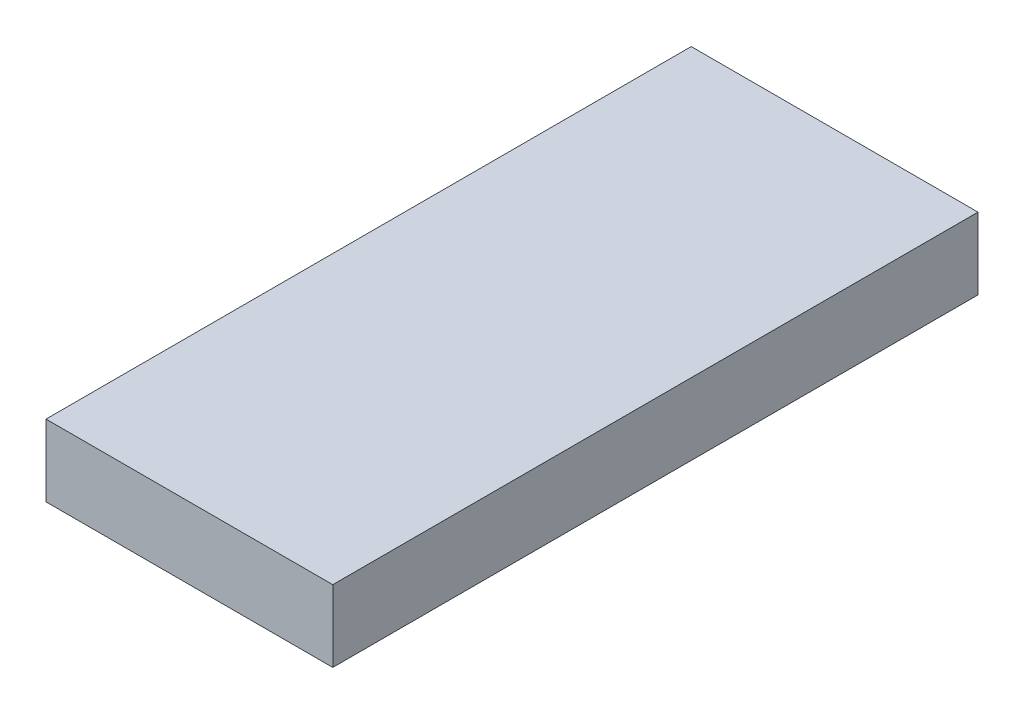
ISO-10303-21;
HEADER;
FILE_DESCRIPTION(('STEP AP214'),'2;1');
FILE_NAME('part.step','',(''),(''),'','','');
FILE_SCHEMA(('AUTOMOTIVE_DESIGN { 1 0 10303 214 1 1 1 1 }'));
ENDSEC;
DATA;
#1=APPLICATION_CONTEXT('core data for automotive mechanical design processes');
#2=APPLICATION_PROTOCOL_DEFINITION('international standard','automotive_design',2000,#1);
#3=PRODUCT_CONTEXT('',#1,'mechanical');
#4=PRODUCT('Part','Part','',(#3));
#5=PRODUCT_RELATED_PRODUCT_CATEGORY('part','',(#4));
#6=PRODUCT_DEFINITION_FORMATION('','',#4);
#7=PRODUCT_DEFINITION_CONTEXT('part definition',#1,'design');
#8=PRODUCT_DEFINITION('design','',#6,#7);
#9=PRODUCT_DEFINITION_SHAPE('','',#8);
#10=(LENGTH_UNIT() NAMED_UNIT(*) SI_UNIT(.MILLI.,.METRE.));
#11=(NAMED_UNIT(*) PLANE_ANGLE_UNIT() SI_UNIT($,.RADIAN.));
#12=(NAMED_UNIT(*) SI_UNIT($,.STERADIAN.) SOLID_ANGLE_UNIT());
#13=UNCERTAINTY_MEASURE_WITH_UNIT(LENGTH_MEASURE(1.E-05),#10,'distance_accuracy_value','');
#14=(GEOMETRIC_REPRESENTATION_CONTEXT(3) GLOBAL_UNCERTAINTY_ASSIGNED_CONTEXT((#13)) GLOBAL_UNIT_ASSIGNED_CONTEXT((#10,
#11,#12)) REPRESENTATION_CONTEXT('',''));
#15=CARTESIAN_POINT('',(0.,0.,0.));
#16=DIRECTION('',(0.,0.,1.));
#17=DIRECTION('',(1.,0.,0.));
#18=AXIS2_PLACEMENT_3D('',#15,#16,#17);
#19=CARTESIAN_POINT('',(-1.99999854,0.499999,0.));
#20=DIRECTION('',(1.,0.,0.));
#21=DIRECTION('',(0.,-1.,0.));
#22=AXIS2_PLACEMENT_3D('',#19,#20,#21);
#23=PLANE('',#22);
#24=DIRECTION('',(0.,-1.,0.));
#25=VECTOR('',#24,1.);
#26=CARTESIAN_POINT('',(-1.99999854,0.499999,0.));
#27=LINE('',#26,#25);
#28=CARTESIAN_POINT('',(-1.99999854,0.499999,0.));
#29=VERTEX_POINT('',#28);
#30=CARTESIAN_POINT('',(-1.99999854,-0.499999,0.));
#31=VERTEX_POINT('',#30);
#32=EDGE_CURVE('E11',#29,#31,#27,.T.);
#33=ORIENTED_EDGE('',*,*,#32,.T.);
#34=DIRECTION('',(0.,0.,1.));
#35=VECTOR('',#34,1.);
#36=CARTESIAN_POINT('',(-1.99999854,-0.499999,0.));
#37=LINE('',#36,#35);
#38=CARTESIAN_POINT('',(-1.99999854,-0.499999,8.99999978));
#39=VERTEX_POINT('',#38);
#40=EDGE_CURVE('E24',#31,#39,#37,.T.);
#41=ORIENTED_EDGE('',*,*,#40,.T.);
#42=DIRECTION('',(0.,-1.,0.));
#43=VECTOR('',#42,1.);
#44=CARTESIAN_POINT('',(-1.99999854,0.499999,8.99999978));
#45=LINE('',#44,#43);
#46=CARTESIAN_POINT('',(-1.99999854,0.499999,8.99999978));
#47=VERTEX_POINT('',#46);
#48=EDGE_CURVE('E87',#47,#39,#45,.T.);
#49=ORIENTED_EDGE('',*,*,#48,.F.);
#50=DIRECTION('',(0.,0.,1.));
#51=VECTOR('',#50,1.);
#52=CARTESIAN_POINT('',(-1.99999854,0.499999,0.));
#53=LINE('',#52,#51);
#54=EDGE_CURVE('E36',#29,#47,#53,.T.);
#55=ORIENTED_EDGE('',*,*,#54,.F.);
#56=EDGE_LOOP('',(#33,#41,#49,#55));
#57=FACE_BOUND('',#56,.T.);
#58=ADVANCED_FACE('F17',(#57),#23,.F.);
#59=CARTESIAN_POINT('',(-1.99999854,-0.499999,0.));
#60=DIRECTION('',(0.,1.,0.));
#61=DIRECTION('',(1.,0.,0.));
#62=AXIS2_PLACEMENT_3D('',#59,#60,#61);
#63=PLANE('',#62);
#64=DIRECTION('',(1.,0.,0.));
#65=VECTOR('',#64,1.);
#66=CARTESIAN_POINT('',(-1.99999854,-0.499999,0.));
#67=LINE('',#66,#65);
#68=CARTESIAN_POINT('',(2.00000108,-0.499999,0.));
#69=VERTEX_POINT('',#68);
#70=EDGE_CURVE('E84',#31,#69,#67,.T.);
#71=ORIENTED_EDGE('',*,*,#70,.T.);
#72=DIRECTION('',(0.,0.,1.));
#73=VECTOR('',#72,1.);
#74=CARTESIAN_POINT('',(2.00000108,-0.499999,0.));
#75=LINE('',#74,#73);
#76=CARTESIAN_POINT('',(2.00000108,-0.499999,8.99999978));
#77=VERTEX_POINT('',#76);
#78=EDGE_CURVE('E82',#69,#77,#75,.T.);
#79=ORIENTED_EDGE('',*,*,#78,.T.);
#80=DIRECTION('',(1.,0.,0.));
#81=VECTOR('',#80,1.);
#82=CARTESIAN_POINT('',(-1.99999854,-0.499999,8.99999978));
#83=LINE('',#82,#81);
#84=EDGE_CURVE('E62',#39,#77,#83,.T.);
#85=ORIENTED_EDGE('',*,*,#84,.F.);
#86=ORIENTED_EDGE('',*,*,#40,.F.);
#87=EDGE_LOOP('',(#71,#79,#85,#86));
#88=FACE_BOUND('',#87,.T.);
#89=ADVANCED_FACE('F89',(#88),#63,.F.);
#90=CARTESIAN_POINT('',(2.00000108,-0.499999,0.));
#91=DIRECTION('',(-1.,0.,0.));
#92=DIRECTION('',(0.,1.,0.));
#93=AXIS2_PLACEMENT_3D('',#90,#91,#92);
#94=PLANE('',#93);
#95=DIRECTION('',(0.,1.,0.));
#96=VECTOR('',#95,1.);
#97=CARTESIAN_POINT('',(2.00000108,-0.499999,0.));
#98=LINE('',#97,#96);
#99=CARTESIAN_POINT('',(2.00000108,0.499999,0.));
#100=VERTEX_POINT('',#99);
#101=EDGE_CURVE('E71',#69,#100,#98,.T.);
#102=ORIENTED_EDGE('',*,*,#101,.T.);
#103=DIRECTION('',(0.,0.,1.));
#104=VECTOR('',#103,1.);
#105=CARTESIAN_POINT('',(2.00000108,0.499999,0.));
#106=LINE('',#105,#104);
#107=CARTESIAN_POINT('',(2.00000108,0.499999,8.99999978));
#108=VERTEX_POINT('',#107);
#109=EDGE_CURVE('E65',#100,#108,#106,.T.);
#110=ORIENTED_EDGE('',*,*,#109,.T.);
#111=DIRECTION('',(0.,1.,0.));
#112=VECTOR('',#111,1.);
#113=CARTESIAN_POINT('',(2.00000108,-0.499999,8.99999978));
#114=LINE('',#113,#112);
#115=EDGE_CURVE('E57',#77,#108,#114,.T.);
#116=ORIENTED_EDGE('',*,*,#115,.F.);
#117=ORIENTED_EDGE('',*,*,#78,.F.);
#118=EDGE_LOOP('',(#102,#110,#116,#117));
#119=FACE_BOUND('',#118,.T.);
#120=ADVANCED_FACE('F69',(#119),#94,.F.);
#121=CARTESIAN_POINT('',(2.00000108,0.499999,0.));
#122=DIRECTION('',(0.,-1.,0.));
#123=DIRECTION('',(-1.,0.,0.));
#124=AXIS2_PLACEMENT_3D('',#121,#122,#123);
#125=PLANE('',#124);
#126=DIRECTION('',(-1.,0.,0.));
#127=VECTOR('',#126,1.);
#128=CARTESIAN_POINT('',(2.00000108,0.499999,0.));
#129=LINE('',#128,#127);
#130=EDGE_CURVE('E66',#100,#29,#129,.T.);
#131=ORIENTED_EDGE('',*,*,#130,.T.);
#132=ORIENTED_EDGE('',*,*,#54,.T.);
#133=DIRECTION('',(-1.,0.,0.));
#134=VECTOR('',#133,1.);
#135=CARTESIAN_POINT('',(2.00000108,0.499999,8.99999978));
#136=LINE('',#135,#134);
#137=EDGE_CURVE('E61',#108,#47,#136,.T.);
#138=ORIENTED_EDGE('',*,*,#137,.F.);
#139=ORIENTED_EDGE('',*,*,#109,.F.);
#140=EDGE_LOOP('',(#131,#132,#138,#139));
#141=FACE_BOUND('',#140,.T.);
#142=ADVANCED_FACE('F76',(#141),#125,.F.);
#143=CARTESIAN_POINT('',(-1.99999854,0.499999,0.));
#144=DIRECTION('',(0.,0.,-1.));
#145=DIRECTION('',(-1.,0.,0.));
#146=AXIS2_PLACEMENT_3D('',#143,#144,#145);
#147=PLANE('',#146);
#148=ORIENTED_EDGE('',*,*,#130,.F.);
#149=ORIENTED_EDGE('',*,*,#101,.F.);
#150=ORIENTED_EDGE('',*,*,#70,.F.);
#151=ORIENTED_EDGE('',*,*,#32,.F.);
#152=EDGE_LOOP('',(#148,#149,#150,#151));
#153=FACE_BOUND('',#152,.T.);
#154=ADVANCED_FACE('F91',(#153),#147,.T.);
#155=CARTESIAN_POINT('',(-1.99999854,0.499999,8.99999978));
#156=DIRECTION('',(0.,0.,-1.));
#157=DIRECTION('',(-1.,0.,0.));
#158=AXIS2_PLACEMENT_3D('',#155,#156,#157);
#159=PLANE('',#158);
#160=ORIENTED_EDGE('',*,*,#48,.T.);
#161=ORIENTED_EDGE('',*,*,#84,.T.);
#162=ORIENTED_EDGE('',*,*,#115,.T.);
#163=ORIENTED_EDGE('',*,*,#137,.T.);
#164=EDGE_LOOP('',(#160,#161,#162,#163));
#165=FACE_BOUND('',#164,.T.);
#166=ADVANCED_FACE('F59',(#165),#159,.F.);
#167=CLOSED_SHELL('',(#58,#89,#120,#142,#154,#166));
#168=MANIFOLD_SOLID_BREP('B1',#167);
#169=ADVANCED_BREP_SHAPE_REPRESENTATION('',(#18,#168),#14);
#170=SHAPE_DEFINITION_REPRESENTATION(#9,#169);
ENDSEC;
END-ISO-10303-21;
